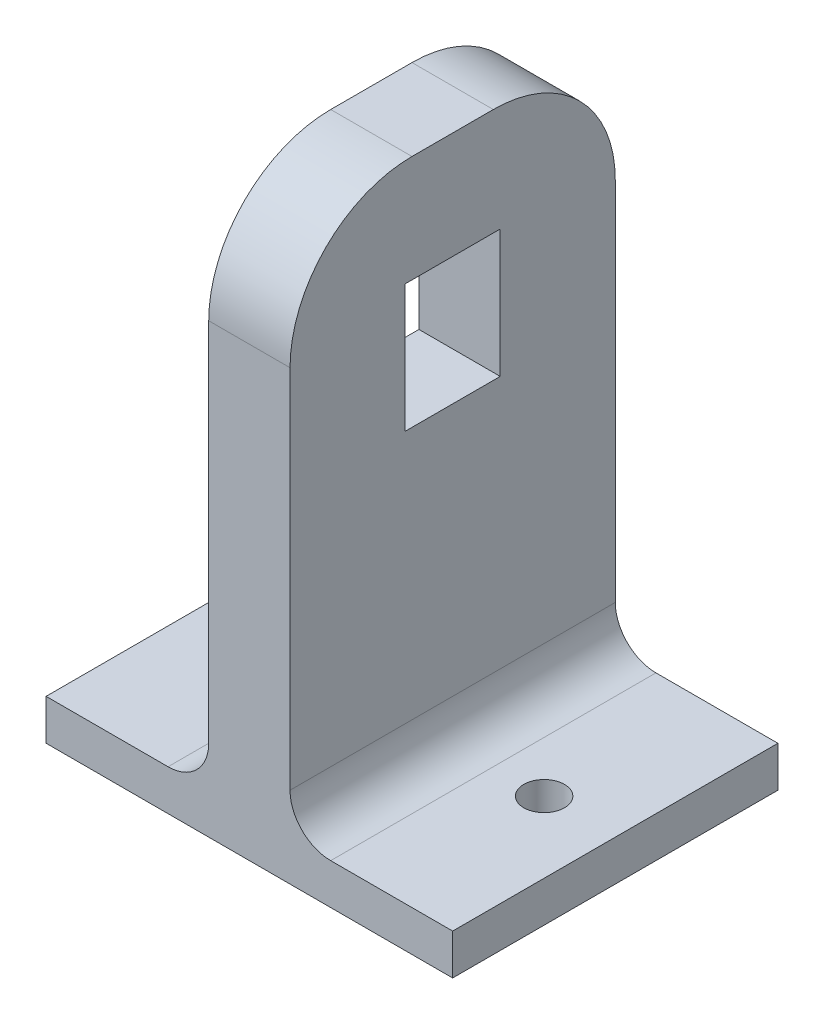
ISO-10303-21;
HEADER;
FILE_DESCRIPTION(('STEP AP214'),'2;1');
FILE_NAME('part.step','',(''),(''),'','','');
FILE_SCHEMA(('AUTOMOTIVE_DESIGN { 1 0 10303 214 1 1 1 1 }'));
ENDSEC;
DATA;
#1=APPLICATION_CONTEXT('core data for automotive mechanical design processes');
#2=APPLICATION_PROTOCOL_DEFINITION('international standard','automotive_design',2000,#1);
#3=PRODUCT_CONTEXT('',#1,'mechanical');
#4=PRODUCT('Part','Part','',(#3));
#5=PRODUCT_RELATED_PRODUCT_CATEGORY('part','',(#4));
#6=PRODUCT_DEFINITION_FORMATION('','',#4);
#7=PRODUCT_DEFINITION_CONTEXT('part definition',#1,'design');
#8=PRODUCT_DEFINITION('design','',#6,#7);
#9=PRODUCT_DEFINITION_SHAPE('','',#8);
#10=(LENGTH_UNIT() NAMED_UNIT(*) SI_UNIT(.MILLI.,.METRE.));
#11=(NAMED_UNIT(*) PLANE_ANGLE_UNIT() SI_UNIT($,.RADIAN.));
#12=(NAMED_UNIT(*) SI_UNIT($,.STERADIAN.) SOLID_ANGLE_UNIT());
#13=UNCERTAINTY_MEASURE_WITH_UNIT(LENGTH_MEASURE(1.E-05),#10,'distance_accuracy_value','');
#14=(GEOMETRIC_REPRESENTATION_CONTEXT(3) GLOBAL_UNCERTAINTY_ASSIGNED_CONTEXT((#13)) GLOBAL_UNIT_ASSIGNED_CONTEXT((#10,
#11,#12)) REPRESENTATION_CONTEXT('',''));
#15=CARTESIAN_POINT('',(0.,0.,0.));
#16=DIRECTION('',(0.,0.,1.));
#17=DIRECTION('',(1.,0.,0.));
#18=AXIS2_PLACEMENT_3D('',#15,#16,#17);
#19=CARTESIAN_POINT('',(6.35,0.,0.));
#20=DIRECTION('',(-1.,0.,0.));
#21=DIRECTION('',(0.,0.,1.));
#22=AXIS2_PLACEMENT_3D('',#19,#20,#21);
#23=PLANE('',#22);
#24=DIRECTION('',(0.,1.,0.));
#25=VECTOR('',#24,1.);
#26=CARTESIAN_POINT('',(6.35,7.81050000000002,-7.4295));
#27=LINE('',#26,#25);
#28=CARTESIAN_POINT('',(6.35,7.81050000000002,-7.4295));
#29=VERTEX_POINT('',#28);
#30=CARTESIAN_POINT('',(6.35,27.7495,-7.4295));
#31=VERTEX_POINT('',#30);
#32=EDGE_CURVE('E198',#29,#31,#27,.T.);
#33=ORIENTED_EDGE('',*,*,#32,.F.);
#34=DIRECTION('',(0.,0.,-1.));
#35=VECTOR('',#34,1.);
#36=CARTESIAN_POINT('',(6.35,7.81050000000002,7.4295));
#37=LINE('',#36,#35);
#38=CARTESIAN_POINT('',(6.35,7.81050000000002,7.4295));
#39=VERTEX_POINT('',#38);
#40=EDGE_CURVE('E206',#39,#29,#37,.T.);
#41=ORIENTED_EDGE('',*,*,#40,.F.);
#42=DIRECTION('',(0.,-1.,0.));
#43=VECTOR('',#42,1.);
#44=CARTESIAN_POINT('',(6.35,7.81050000000002,7.4295));
#45=LINE('',#44,#43);
#46=CARTESIAN_POINT('',(6.35,27.7495,7.4295));
#47=VERTEX_POINT('',#46);
#48=EDGE_CURVE('E203',#47,#39,#45,.T.);
#49=ORIENTED_EDGE('',*,*,#48,.F.);
#50=DIRECTION('',(0.,0.,1.));
#51=VECTOR('',#50,1.);
#52=CARTESIAN_POINT('',(6.35,27.7495,7.4295));
#53=LINE('',#52,#51);
#54=EDGE_CURVE('E200',#31,#47,#53,.T.);
#55=ORIENTED_EDGE('',*,*,#54,.F.);
#56=EDGE_LOOP('',(#33,#41,#49,#55));
#57=FACE_BOUND('',#56,.T.);
#58=DIRECTION('',(0.,1.,0.));
#59=VECTOR('',#58,1.);
#60=CARTESIAN_POINT('',(6.35,-44.45,-25.4));
#61=LINE('',#60,#59);
#62=CARTESIAN_POINT('',(6.35,-31.75,-25.4));
#63=VERTEX_POINT('',#62);
#64=CARTESIAN_POINT('',(6.35,25.4,-25.4));
#65=VERTEX_POINT('',#64);
#66=EDGE_CURVE('E229',#63,#65,#61,.T.);
#67=ORIENTED_EDGE('',*,*,#66,.T.);
#68=CARTESIAN_POINT('',(6.35,25.4,-6.35));
#69=DIRECTION('',(-1.,0.,0.));
#70=DIRECTION('',(0.,0.,1.));
#71=AXIS2_PLACEMENT_3D('',#68,#69,#70);
#72=CIRCLE('',#71,19.05);
#73=CARTESIAN_POINT('',(6.35,44.45,-6.35));
#74=VERTEX_POINT('',#73);
#75=EDGE_CURVE('E40',#65,#74,#72,.F.);
#76=ORIENTED_EDGE('',*,*,#75,.T.);
#77=DIRECTION('',(0.,0.,1.));
#78=VECTOR('',#77,1.);
#79=CARTESIAN_POINT('',(6.35,44.45,25.4));
#80=LINE('',#79,#78);
#81=CARTESIAN_POINT('',(6.35,44.45,6.35));
#82=VERTEX_POINT('',#81);
#83=EDGE_CURVE('E231',#74,#82,#80,.T.);
#84=ORIENTED_EDGE('',*,*,#83,.T.);
#85=CARTESIAN_POINT('',(6.35,25.4,6.35));
#86=DIRECTION('',(-1.,0.,0.));
#87=DIRECTION('',(0.,0.,1.));
#88=AXIS2_PLACEMENT_3D('',#85,#86,#87);
#89=CIRCLE('',#88,19.05);
#90=CARTESIAN_POINT('',(6.35,25.4,25.4));
#91=VERTEX_POINT('',#90);
#92=EDGE_CURVE('E47',#82,#91,#89,.F.);
#93=ORIENTED_EDGE('',*,*,#92,.T.);
#94=DIRECTION('',(0.,-1.,0.));
#95=VECTOR('',#94,1.);
#96=CARTESIAN_POINT('',(6.35,-44.45,25.4));
#97=LINE('',#96,#95);
#98=CARTESIAN_POINT('',(6.35,-31.75,25.4));
#99=VERTEX_POINT('',#98);
#100=EDGE_CURVE('E234',#91,#99,#97,.T.);
#101=ORIENTED_EDGE('',*,*,#100,.T.);
#102=DIRECTION('',(0.,0.,1.));
#103=VECTOR('',#102,1.);
#104=CARTESIAN_POINT('',(6.35,-31.75,-25.4));
#105=LINE('',#104,#103);
#106=EDGE_CURVE('E249',#99,#63,#105,.F.);
#107=ORIENTED_EDGE('',*,*,#106,.T.);
#108=EDGE_LOOP('',(#67,#76,#84,#93,#101,#107));
#109=FACE_BOUND('',#108,.T.);
#110=ADVANCED_FACE('F32',(#57,#109),#23,.F.);
#111=CARTESIAN_POINT('',(-6.35,0.,0.));
#112=DIRECTION('',(-1.,0.,0.));
#113=DIRECTION('',(0.,0.,1.));
#114=AXIS2_PLACEMENT_3D('',#111,#112,#113);
#115=PLANE('',#114);
#116=DIRECTION('',(0.,0.,-1.));
#117=VECTOR('',#116,1.);
#118=CARTESIAN_POINT('',(-6.35,7.81050000000002,7.4295));
#119=LINE('',#118,#117);
#120=CARTESIAN_POINT('',(-6.35,7.81050000000002,7.4295));
#121=VERTEX_POINT('',#120);
#122=CARTESIAN_POINT('',(-6.35,7.81050000000002,-7.4295));
#123=VERTEX_POINT('',#122);
#124=EDGE_CURVE('E201',#121,#123,#119,.T.);
#125=ORIENTED_EDGE('',*,*,#124,.T.);
#126=DIRECTION('',(0.,1.,0.));
#127=VECTOR('',#126,1.);
#128=CARTESIAN_POINT('',(-6.35,7.81050000000002,-7.4295));
#129=LINE('',#128,#127);
#130=CARTESIAN_POINT('',(-6.35,27.7495,-7.4295));
#131=VERTEX_POINT('',#130);
#132=EDGE_CURVE('E197',#123,#131,#129,.T.);
#133=ORIENTED_EDGE('',*,*,#132,.T.);
#134=DIRECTION('',(0.,0.,1.));
#135=VECTOR('',#134,1.);
#136=CARTESIAN_POINT('',(-6.35,27.7495,7.4295));
#137=LINE('',#136,#135);
#138=CARTESIAN_POINT('',(-6.35,27.7495,7.4295));
#139=VERTEX_POINT('',#138);
#140=EDGE_CURVE('E211',#131,#139,#137,.T.);
#141=ORIENTED_EDGE('',*,*,#140,.T.);
#142=DIRECTION('',(0.,-1.,0.));
#143=VECTOR('',#142,1.);
#144=CARTESIAN_POINT('',(-6.35,7.81050000000002,7.4295));
#145=LINE('',#144,#143);
#146=EDGE_CURVE('E214',#139,#121,#145,.T.);
#147=ORIENTED_EDGE('',*,*,#146,.T.);
#148=EDGE_LOOP('',(#125,#133,#141,#147));
#149=FACE_BOUND('',#148,.T.);
#150=DIRECTION('',(0.,0.,1.));
#151=VECTOR('',#150,1.);
#152=CARTESIAN_POINT('',(-6.35,44.45,25.4));
#153=LINE('',#152,#151);
#154=CARTESIAN_POINT('',(-6.35,44.45,-6.35));
#155=VERTEX_POINT('',#154);
#156=CARTESIAN_POINT('',(-6.35,44.45,6.35));
#157=VERTEX_POINT('',#156);
#158=EDGE_CURVE('E237',#155,#157,#153,.T.);
#159=ORIENTED_EDGE('',*,*,#158,.F.);
#160=CARTESIAN_POINT('',(-6.35,25.4,-6.35));
#161=DIRECTION('',(-1.,0.,0.));
#162=DIRECTION('',(0.,0.,1.));
#163=AXIS2_PLACEMENT_3D('',#160,#161,#162);
#164=CIRCLE('',#163,19.05);
#165=CARTESIAN_POINT('',(-6.35,25.4,-25.4));
#166=VERTEX_POINT('',#165);
#167=EDGE_CURVE('E267',#155,#166,#164,.T.);
#168=ORIENTED_EDGE('',*,*,#167,.T.);
#169=DIRECTION('',(0.,1.,0.));
#170=VECTOR('',#169,1.);
#171=CARTESIAN_POINT('',(-6.35,-44.45,-25.4));
#172=LINE('',#171,#170);
#173=CARTESIAN_POINT('',(-6.35,-31.75,-25.4));
#174=VERTEX_POINT('',#173);
#175=EDGE_CURVE('E228',#174,#166,#172,.T.);
#176=ORIENTED_EDGE('',*,*,#175,.F.);
#177=DIRECTION('',(0.,0.,1.));
#178=VECTOR('',#177,1.);
#179=CARTESIAN_POINT('',(-6.35,-31.75,0.));
#180=LINE('',#179,#178);
#181=CARTESIAN_POINT('',(-6.35,-31.75,25.4));
#182=VERTEX_POINT('',#181);
#183=EDGE_CURVE('E159',#174,#182,#180,.T.);
#184=ORIENTED_EDGE('',*,*,#183,.T.);
#185=DIRECTION('',(0.,-1.,0.));
#186=VECTOR('',#185,1.);
#187=CARTESIAN_POINT('',(-6.35,-44.45,25.4));
#188=LINE('',#187,#186);
#189=CARTESIAN_POINT('',(-6.35,25.4,25.4));
#190=VERTEX_POINT('',#189);
#191=EDGE_CURVE('E232',#190,#182,#188,.T.);
#192=ORIENTED_EDGE('',*,*,#191,.F.);
#193=CARTESIAN_POINT('',(-6.35,25.4,6.35));
#194=DIRECTION('',(-1.,0.,0.));
#195=DIRECTION('',(0.,0.,1.));
#196=AXIS2_PLACEMENT_3D('',#193,#194,#195);
#197=CIRCLE('',#196,19.05);
#198=EDGE_CURVE('E265',#190,#157,#197,.T.);
#199=ORIENTED_EDGE('',*,*,#198,.T.);
#200=EDGE_LOOP('',(#159,#168,#176,#184,#192,#199));
#201=FACE_BOUND('',#200,.T.);
#202=ADVANCED_FACE('F281',(#149,#201),#115,.T.);
#203=CARTESIAN_POINT('',(6.35,-44.45,-25.4));
#204=DIRECTION('',(0.,0.,1.));
#205=DIRECTION('',(1.,0.,0.));
#206=AXIS2_PLACEMENT_3D('',#203,#204,#205);
#207=PLANE('',#206);
#208=ORIENTED_EDGE('',*,*,#175,.T.);
#209=DIRECTION('',(-1.,0.,0.));
#210=VECTOR('',#209,1.);
#211=CARTESIAN_POINT('',(6.35,25.4,-25.4));
#212=LINE('',#211,#210);
#213=EDGE_CURVE('E55',#166,#65,#212,.F.);
#214=ORIENTED_EDGE('',*,*,#213,.T.);
#215=ORIENTED_EDGE('',*,*,#66,.F.);
#216=CARTESIAN_POINT('',(12.7,-31.75,-25.4));
#217=DIRECTION('',(0.,0.,1.));
#218=DIRECTION('',(1.,0.,0.));
#219=AXIS2_PLACEMENT_3D('',#216,#217,#218);
#220=CIRCLE('',#219,6.35);
#221=CARTESIAN_POINT('',(12.7,-38.1,-25.4));
#222=VERTEX_POINT('',#221);
#223=EDGE_CURVE('E258',#63,#222,#220,.T.);
#224=ORIENTED_EDGE('',*,*,#223,.T.);
#225=DIRECTION('',(-1.,0.,0.));
#226=VECTOR('',#225,1.);
#227=CARTESIAN_POINT('',(31.75,-38.1,-25.4));
#228=LINE('',#227,#226);
#229=CARTESIAN_POINT('',(31.75,-38.1,-25.4));
#230=VERTEX_POINT('',#229);
#231=EDGE_CURVE('E194',#230,#222,#228,.T.);
#232=ORIENTED_EDGE('',*,*,#231,.F.);
#233=DIRECTION('',(0.,1.,0.));
#234=VECTOR('',#233,1.);
#235=CARTESIAN_POINT('',(31.75,-44.45,-25.4));
#236=LINE('',#235,#234);
#237=CARTESIAN_POINT('',(31.75,-44.45,-25.4));
#238=VERTEX_POINT('',#237);
#239=EDGE_CURVE('E167',#238,#230,#236,.T.);
#240=ORIENTED_EDGE('',*,*,#239,.F.);
#241=DIRECTION('',(-1.,0.,0.));
#242=VECTOR('',#241,1.);
#243=CARTESIAN_POINT('',(6.35,-44.45,-25.4));
#244=LINE('',#243,#242);
#245=CARTESIAN_POINT('',(-31.75,-44.45,-25.4));
#246=VERTEX_POINT('',#245);
#247=EDGE_CURVE('E160',#238,#246,#244,.T.);
#248=ORIENTED_EDGE('',*,*,#247,.T.);
#249=DIRECTION('',(0.,1.,0.));
#250=VECTOR('',#249,1.);
#251=CARTESIAN_POINT('',(-31.75,-44.45,-25.4));
#252=LINE('',#251,#250);
#253=CARTESIAN_POINT('',(-31.75,-38.1,-25.4));
#254=VERTEX_POINT('',#253);
#255=EDGE_CURVE('E176',#246,#254,#252,.T.);
#256=ORIENTED_EDGE('',*,*,#255,.T.);
#257=CARTESIAN_POINT('',(-12.7,-38.1,-25.4));
#258=VERTEX_POINT('',#257);
#259=EDGE_CURVE('E193',#258,#254,#228,.T.);
#260=ORIENTED_EDGE('',*,*,#259,.F.);
#261=CARTESIAN_POINT('',(-12.7,-31.75,-25.4));
#262=DIRECTION('',(0.,0.,1.));
#263=DIRECTION('',(1.,0.,0.));
#264=AXIS2_PLACEMENT_3D('',#261,#262,#263);
#265=CIRCLE('',#264,6.35);
#266=EDGE_CURVE('E253',#258,#174,#265,.T.);
#267=ORIENTED_EDGE('',*,*,#266,.T.);
#268=EDGE_LOOP('',(#208,#214,#215,#224,#232,#240,#248,#256,#260,#267));
#269=FACE_BOUND('',#268,.T.);
#270=ADVANCED_FACE('F283',(#269),#207,.F.);
#271=CARTESIAN_POINT('',(6.35,44.45,25.4));
#272=DIRECTION('',(0.,-1.,0.));
#273=DIRECTION('',(0.,0.,-1.));
#274=AXIS2_PLACEMENT_3D('',#271,#272,#273);
#275=PLANE('',#274);
#276=ORIENTED_EDGE('',*,*,#83,.F.);
#277=DIRECTION('',(-1.,0.,0.));
#278=VECTOR('',#277,1.);
#279=CARTESIAN_POINT('',(6.35,44.45,-6.35));
#280=LINE('',#279,#278);
#281=EDGE_CURVE('E262',#74,#155,#280,.T.);
#282=ORIENTED_EDGE('',*,*,#281,.T.);
#283=ORIENTED_EDGE('',*,*,#158,.T.);
#284=DIRECTION('',(-1.,0.,0.));
#285=VECTOR('',#284,1.);
#286=CARTESIAN_POINT('',(6.35,44.45,6.35));
#287=LINE('',#286,#285);
#288=EDGE_CURVE('E260',#157,#82,#287,.F.);
#289=ORIENTED_EDGE('',*,*,#288,.T.);
#290=EDGE_LOOP('',(#276,#282,#283,#289));
#291=FACE_BOUND('',#290,.T.);
#292=ADVANCED_FACE('F275',(#291),#275,.F.);
#293=CARTESIAN_POINT('',(6.35,-44.45,25.4));
#294=DIRECTION('',(0.,0.,-1.));
#295=DIRECTION('',(-1.,0.,0.));
#296=AXIS2_PLACEMENT_3D('',#293,#294,#295);
#297=PLANE('',#296);
#298=ORIENTED_EDGE('',*,*,#100,.F.);
#299=DIRECTION('',(-1.,0.,0.));
#300=VECTOR('',#299,1.);
#301=CARTESIAN_POINT('',(6.35,25.4,25.4));
#302=LINE('',#301,#300);
#303=EDGE_CURVE('E11',#91,#190,#302,.T.);
#304=ORIENTED_EDGE('',*,*,#303,.T.);
#305=ORIENTED_EDGE('',*,*,#191,.T.);
#306=CARTESIAN_POINT('',(-12.7,-31.75,25.4));
#307=DIRECTION('',(0.,0.,-1.));
#308=DIRECTION('',(-1.,0.,0.));
#309=AXIS2_PLACEMENT_3D('',#306,#307,#308);
#310=CIRCLE('',#309,6.35);
#311=CARTESIAN_POINT('',(-12.7,-38.1,25.4));
#312=VERTEX_POINT('',#311);
#313=EDGE_CURVE('E251',#182,#312,#310,.T.);
#314=ORIENTED_EDGE('',*,*,#313,.T.);
#315=DIRECTION('',(-1.,0.,0.));
#316=VECTOR('',#315,1.);
#317=CARTESIAN_POINT('',(31.75,-38.1,25.4));
#318=LINE('',#317,#316);
#319=CARTESIAN_POINT('',(-31.75,-38.1,25.4));
#320=VERTEX_POINT('',#319);
#321=EDGE_CURVE('E184',#312,#320,#318,.T.);
#322=ORIENTED_EDGE('',*,*,#321,.T.);
#323=DIRECTION('',(0.,-1.,0.));
#324=VECTOR('',#323,1.);
#325=CARTESIAN_POINT('',(-31.75,-44.45,25.4));
#326=LINE('',#325,#324);
#327=CARTESIAN_POINT('',(-31.75,-44.45,25.4));
#328=VERTEX_POINT('',#327);
#329=EDGE_CURVE('E155',#320,#328,#326,.T.);
#330=ORIENTED_EDGE('',*,*,#329,.T.);
#331=DIRECTION('',(-1.,0.,0.));
#332=VECTOR('',#331,1.);
#333=CARTESIAN_POINT('',(6.35,-44.45,25.4));
#334=LINE('',#333,#332);
#335=CARTESIAN_POINT('',(31.75,-44.45,25.4));
#336=VERTEX_POINT('',#335);
#337=EDGE_CURVE('E148',#336,#328,#334,.T.);
#338=ORIENTED_EDGE('',*,*,#337,.F.);
#339=DIRECTION('',(0.,-1.,0.));
#340=VECTOR('',#339,1.);
#341=CARTESIAN_POINT('',(31.75,-44.45,25.4));
#342=LINE('',#341,#340);
#343=CARTESIAN_POINT('',(31.75,-38.1,25.4));
#344=VERTEX_POINT('',#343);
#345=EDGE_CURVE('E153',#344,#336,#342,.T.);
#346=ORIENTED_EDGE('',*,*,#345,.F.);
#347=CARTESIAN_POINT('',(12.7,-38.1,25.4));
#348=VERTEX_POINT('',#347);
#349=EDGE_CURVE('E191',#344,#348,#318,.T.);
#350=ORIENTED_EDGE('',*,*,#349,.T.);
#351=CARTESIAN_POINT('',(12.7,-31.75,25.4));
#352=DIRECTION('',(0.,0.,-1.));
#353=DIRECTION('',(-1.,0.,0.));
#354=AXIS2_PLACEMENT_3D('',#351,#352,#353);
#355=CIRCLE('',#354,6.35);
#356=EDGE_CURVE('E255',#348,#99,#355,.T.);
#357=ORIENTED_EDGE('',*,*,#356,.T.);
#358=EDGE_LOOP('',(#298,#304,#305,#314,#322,#330,#338,#346,#350,#357));
#359=FACE_BOUND('',#358,.T.);
#360=ADVANCED_FACE('F150',(#359),#297,.F.);
#361=CARTESIAN_POINT('',(6.35,-44.45,25.4));
#362=DIRECTION('',(0.,1.,0.));
#363=DIRECTION('',(0.,0.,1.));
#364=AXIS2_PLACEMENT_3D('',#361,#362,#363);
#365=PLANE('',#364);
#366=CARTESIAN_POINT('',(-20.6375,-44.45,0.));
#367=DIRECTION('',(0.,-1.,0.));
#368=DIRECTION('',(0.,0.,1.));
#369=AXIS2_PLACEMENT_3D('',#366,#367,#368);
#370=CIRCLE('',#369,3.175);
#371=CARTESIAN_POINT('',(-20.6375,-44.45,3.175));
#372=VERTEX_POINT('',#371);
#373=EDGE_CURVE('E504',#372,#372,#370,.T.);
#374=ORIENTED_EDGE('',*,*,#373,.F.);
#375=EDGE_LOOP('',(#374));
#376=FACE_BOUND('',#375,.T.);
#377=CARTESIAN_POINT('',(20.6375,-44.45,0.));
#378=DIRECTION('',(0.,1.,0.));
#379=DIRECTION('',(0.,0.,1.));
#380=AXIS2_PLACEMENT_3D('',#377,#378,#379);
#381=CIRCLE('',#380,3.175);
#382=CARTESIAN_POINT('',(20.6375,-44.45,3.175));
#383=VERTEX_POINT('',#382);
#384=EDGE_CURVE('E187',#383,#383,#381,.T.);
#385=ORIENTED_EDGE('',*,*,#384,.T.);
#386=EDGE_LOOP('',(#385));
#387=FACE_BOUND('',#386,.T.);
#388=ORIENTED_EDGE('',*,*,#337,.T.);
#389=DIRECTION('',(0.,0.,-1.));
#390=VECTOR('',#389,1.);
#391=CARTESIAN_POINT('',(-31.75,-44.45,25.4));
#392=LINE('',#391,#390);
#393=EDGE_CURVE('E186',#328,#246,#392,.T.);
#394=ORIENTED_EDGE('',*,*,#393,.T.);
#395=ORIENTED_EDGE('',*,*,#247,.F.);
#396=DIRECTION('',(0.,0.,-1.));
#397=VECTOR('',#396,1.);
#398=CARTESIAN_POINT('',(31.75,-44.45,25.4));
#399=LINE('',#398,#397);
#400=EDGE_CURVE('E163',#336,#238,#399,.T.);
#401=ORIENTED_EDGE('',*,*,#400,.F.);
#402=EDGE_LOOP('',(#388,#394,#395,#401));
#403=FACE_BOUND('',#402,.T.);
#404=ADVANCED_FACE('F164',(#376,#387,#403),#365,.F.);
#405=CARTESIAN_POINT('',(6.35,7.81050000000002,-7.4295));
#406=DIRECTION('',(0.,0.,1.));
#407=DIRECTION('',(1.,0.,0.));
#408=AXIS2_PLACEMENT_3D('',#405,#406,#407);
#409=PLANE('',#408);
#410=ORIENTED_EDGE('',*,*,#132,.F.);
#411=DIRECTION('',(-1.,0.,0.));
#412=VECTOR('',#411,1.);
#413=CARTESIAN_POINT('',(6.35,7.81050000000002,-7.4295));
#414=LINE('',#413,#412);
#415=EDGE_CURVE('E208',#29,#123,#414,.T.);
#416=ORIENTED_EDGE('',*,*,#415,.F.);
#417=ORIENTED_EDGE('',*,*,#32,.T.);
#418=DIRECTION('',(-1.,0.,0.));
#419=VECTOR('',#418,1.);
#420=CARTESIAN_POINT('',(6.35,27.7495,-7.4295));
#421=LINE('',#420,#419);
#422=EDGE_CURVE('E225',#31,#131,#421,.T.);
#423=ORIENTED_EDGE('',*,*,#422,.T.);
#424=EDGE_LOOP('',(#410,#416,#417,#423));
#425=FACE_BOUND('',#424,.T.);
#426=ADVANCED_FACE('F309',(#425),#409,.T.);
#427=CARTESIAN_POINT('',(6.35,27.7495,7.4295));
#428=DIRECTION('',(0.,-1.,0.));
#429=DIRECTION('',(0.,0.,-1.));
#430=AXIS2_PLACEMENT_3D('',#427,#428,#429);
#431=PLANE('',#430);
#432=ORIENTED_EDGE('',*,*,#140,.F.);
#433=ORIENTED_EDGE('',*,*,#422,.F.);
#434=ORIENTED_EDGE('',*,*,#54,.T.);
#435=DIRECTION('',(-1.,0.,0.));
#436=VECTOR('',#435,1.);
#437=CARTESIAN_POINT('',(6.35,27.7495,7.4295));
#438=LINE('',#437,#436);
#439=EDGE_CURVE('E223',#47,#139,#438,.T.);
#440=ORIENTED_EDGE('',*,*,#439,.T.);
#441=EDGE_LOOP('',(#432,#433,#434,#440));
#442=FACE_BOUND('',#441,.T.);
#443=ADVANCED_FACE('F358',(#442),#431,.T.);
#444=CARTESIAN_POINT('',(6.35,7.81050000000002,7.4295));
#445=DIRECTION('',(0.,0.,-1.));
#446=DIRECTION('',(-1.,0.,0.));
#447=AXIS2_PLACEMENT_3D('',#444,#445,#446);
#448=PLANE('',#447);
#449=ORIENTED_EDGE('',*,*,#146,.F.);
#450=ORIENTED_EDGE('',*,*,#439,.F.);
#451=ORIENTED_EDGE('',*,*,#48,.T.);
#452=DIRECTION('',(-1.,0.,0.));
#453=VECTOR('',#452,1.);
#454=CARTESIAN_POINT('',(6.35,7.81050000000002,7.4295));
#455=LINE('',#454,#453);
#456=EDGE_CURVE('E221',#39,#121,#455,.T.);
#457=ORIENTED_EDGE('',*,*,#456,.T.);
#458=EDGE_LOOP('',(#449,#450,#451,#457));
#459=FACE_BOUND('',#458,.T.);
#460=ADVANCED_FACE('F355',(#459),#448,.T.);
#461=CARTESIAN_POINT('',(6.35,7.81050000000002,7.4295));
#462=DIRECTION('',(0.,1.,0.));
#463=DIRECTION('',(0.,0.,1.));
#464=AXIS2_PLACEMENT_3D('',#461,#462,#463);
#465=PLANE('',#464);
#466=ORIENTED_EDGE('',*,*,#124,.F.);
#467=ORIENTED_EDGE('',*,*,#456,.F.);
#468=ORIENTED_EDGE('',*,*,#40,.T.);
#469=ORIENTED_EDGE('',*,*,#415,.T.);
#470=EDGE_LOOP('',(#466,#467,#468,#469));
#471=FACE_BOUND('',#470,.T.);
#472=ADVANCED_FACE('F352',(#471),#465,.T.);
#473=CARTESIAN_POINT('',(-31.75,0.,0.));
#474=DIRECTION('',(-1.,0.,0.));
#475=DIRECTION('',(0.,0.,1.));
#476=AXIS2_PLACEMENT_3D('',#473,#474,#475);
#477=PLANE('',#476);
#478=ORIENTED_EDGE('',*,*,#329,.F.);
#479=DIRECTION('',(0.,0.,1.));
#480=VECTOR('',#479,1.);
#481=CARTESIAN_POINT('',(-31.75,-38.1,25.4));
#482=LINE('',#481,#480);
#483=EDGE_CURVE('E173',#254,#320,#482,.T.);
#484=ORIENTED_EDGE('',*,*,#483,.F.);
#485=ORIENTED_EDGE('',*,*,#255,.F.);
#486=ORIENTED_EDGE('',*,*,#393,.F.);
#487=EDGE_LOOP('',(#478,#484,#485,#486));
#488=FACE_BOUND('',#487,.T.);
#489=ADVANCED_FACE('F347',(#488),#477,.T.);
#490=CARTESIAN_POINT('',(31.75,-38.1,25.4));
#491=DIRECTION('',(0.,-1.,0.));
#492=DIRECTION('',(0.,0.,-1.));
#493=AXIS2_PLACEMENT_3D('',#490,#491,#492);
#494=PLANE('',#493);
#495=CARTESIAN_POINT('',(-20.6375,-38.1,0.));
#496=DIRECTION('',(0.,-1.,0.));
#497=DIRECTION('',(0.,0.,1.));
#498=AXIS2_PLACEMENT_3D('',#495,#496,#497);
#499=CIRCLE('',#498,3.175);
#500=CARTESIAN_POINT('',(-20.6375,-38.1,3.175));
#501=VERTEX_POINT('',#500);
#502=EDGE_CURVE('E507',#501,#501,#499,.T.);
#503=ORIENTED_EDGE('',*,*,#502,.T.);
#504=EDGE_LOOP('',(#503));
#505=FACE_BOUND('',#504,.T.);
#506=ORIENTED_EDGE('',*,*,#321,.F.);
#507=DIRECTION('',(0.,0.,1.));
#508=VECTOR('',#507,1.);
#509=CARTESIAN_POINT('',(-12.7,-38.1,25.4));
#510=LINE('',#509,#508);
#511=EDGE_CURVE('E244',#312,#258,#510,.F.);
#512=ORIENTED_EDGE('',*,*,#511,.T.);
#513=ORIENTED_EDGE('',*,*,#259,.T.);
#514=ORIENTED_EDGE('',*,*,#483,.T.);
#515=EDGE_LOOP('',(#506,#512,#513,#514));
#516=FACE_BOUND('',#515,.T.);
#517=ADVANCED_FACE('F339',(#505,#516),#494,.F.);
#518=CARTESIAN_POINT('',(20.6375,-38.1,0.));
#519=DIRECTION('',(0.,1.,0.));
#520=DIRECTION('',(0.,0.,1.));
#521=AXIS2_PLACEMENT_3D('',#518,#519,#520);
#522=CIRCLE('',#521,3.175);
#523=CARTESIAN_POINT('',(20.6375,-38.1,3.175));
#524=VERTEX_POINT('',#523);
#525=EDGE_CURVE('E179',#524,#524,#522,.T.);
#526=ORIENTED_EDGE('',*,*,#525,.F.);
#527=EDGE_LOOP('',(#526));
#528=FACE_BOUND('',#527,.T.);
#529=ORIENTED_EDGE('',*,*,#231,.T.);
#530=DIRECTION('',(0.,0.,1.));
#531=VECTOR('',#530,1.);
#532=CARTESIAN_POINT('',(12.7,-38.1,25.4));
#533=LINE('',#532,#531);
#534=EDGE_CURVE('E246',#222,#348,#533,.T.);
#535=ORIENTED_EDGE('',*,*,#534,.T.);
#536=ORIENTED_EDGE('',*,*,#349,.F.);
#537=DIRECTION('',(0.,0.,1.));
#538=VECTOR('',#537,1.);
#539=CARTESIAN_POINT('',(31.75,-38.1,25.4));
#540=LINE('',#539,#538);
#541=EDGE_CURVE('E171',#230,#344,#540,.T.);
#542=ORIENTED_EDGE('',*,*,#541,.F.);
#543=EDGE_LOOP('',(#529,#535,#536,#542));
#544=FACE_BOUND('',#543,.T.);
#545=ADVANCED_FACE('F337',(#528,#544),#494,.F.);
#546=CARTESIAN_POINT('',(31.75,0.,0.));
#547=DIRECTION('',(-1.,0.,0.));
#548=DIRECTION('',(0.,0.,1.));
#549=AXIS2_PLACEMENT_3D('',#546,#547,#548);
#550=PLANE('',#549);
#551=ORIENTED_EDGE('',*,*,#345,.T.);
#552=ORIENTED_EDGE('',*,*,#400,.T.);
#553=ORIENTED_EDGE('',*,*,#239,.T.);
#554=ORIENTED_EDGE('',*,*,#541,.T.);
#555=EDGE_LOOP('',(#551,#552,#553,#554));
#556=FACE_BOUND('',#555,.T.);
#557=ADVANCED_FACE('F169',(#556),#550,.F.);
#558=CARTESIAN_POINT('',(-12.7,-31.75,0.));
#559=DIRECTION('',(0.,0.,1.));
#560=DIRECTION('',(1.,0.,0.));
#561=AXIS2_PLACEMENT_3D('',#558,#559,#560);
#562=CYLINDRICAL_SURFACE('',#561,6.35);
#563=ORIENTED_EDGE('',*,*,#266,.F.);
#564=ORIENTED_EDGE('',*,*,#511,.F.);
#565=ORIENTED_EDGE('',*,*,#313,.F.);
#566=ORIENTED_EDGE('',*,*,#183,.F.);
#567=EDGE_LOOP('',(#563,#564,#565,#566));
#568=FACE_BOUND('',#567,.T.);
#569=ADVANCED_FACE('F288',(#568),#562,.F.);
#570=CARTESIAN_POINT('',(12.7,-31.75,25.4));
#571=DIRECTION('',(0.,0.,-1.));
#572=DIRECTION('',(-1.,0.,0.));
#573=AXIS2_PLACEMENT_3D('',#570,#571,#572);
#574=CYLINDRICAL_SURFACE('',#573,6.35);
#575=ORIENTED_EDGE('',*,*,#223,.F.);
#576=ORIENTED_EDGE('',*,*,#106,.F.);
#577=ORIENTED_EDGE('',*,*,#356,.F.);
#578=ORIENTED_EDGE('',*,*,#534,.F.);
#579=EDGE_LOOP('',(#575,#576,#577,#578));
#580=FACE_BOUND('',#579,.T.);
#581=ADVANCED_FACE('F323',(#580),#574,.F.);
#582=CARTESIAN_POINT('',(20.6375,-44.45,0.));
#583=DIRECTION('',(0.,1.,0.));
#584=DIRECTION('',(0.,0.,1.));
#585=AXIS2_PLACEMENT_3D('',#582,#583,#584);
#586=CYLINDRICAL_SURFACE('',#585,3.175);
#587=ORIENTED_EDGE('',*,*,#384,.F.);
#588=EDGE_LOOP('',(#587));
#589=FACE_BOUND('',#588,.T.);
#590=ORIENTED_EDGE('',*,*,#525,.T.);
#591=EDGE_LOOP('',(#590));
#592=FACE_BOUND('',#591,.T.);
#593=ADVANCED_FACE('F325',(#589,#592),#586,.F.);
#594=CARTESIAN_POINT('',(-20.6375,-44.45,0.));
#595=DIRECTION('',(0.,1.,0.));
#596=DIRECTION('',(0.,0.,1.));
#597=AXIS2_PLACEMENT_3D('',#594,#595,#596);
#598=CYLINDRICAL_SURFACE('',#597,3.175);
#599=ORIENTED_EDGE('',*,*,#373,.T.);
#600=EDGE_LOOP('',(#599));
#601=FACE_BOUND('',#600,.T.);
#602=ORIENTED_EDGE('',*,*,#502,.F.);
#603=EDGE_LOOP('',(#602));
#604=FACE_BOUND('',#603,.T.);
#605=ADVANCED_FACE('F298',(#601,#604),#598,.F.);
#606=CARTESIAN_POINT('',(6.35,25.4,-6.35));
#607=DIRECTION('',(-1.,0.,0.));
#608=DIRECTION('',(0.,0.,1.));
#609=AXIS2_PLACEMENT_3D('',#606,#607,#608);
#610=CYLINDRICAL_SURFACE('',#609,19.05);
#611=ORIENTED_EDGE('',*,*,#75,.F.);
#612=ORIENTED_EDGE('',*,*,#213,.F.);
#613=ORIENTED_EDGE('',*,*,#167,.F.);
#614=ORIENTED_EDGE('',*,*,#281,.F.);
#615=EDGE_LOOP('',(#611,#612,#613,#614));
#616=FACE_BOUND('',#615,.T.);
#617=ADVANCED_FACE('F278',(#616),#610,.T.);
#618=CARTESIAN_POINT('',(6.35,25.4,6.35));
#619=DIRECTION('',(-1.,0.,0.));
#620=DIRECTION('',(0.,0.,1.));
#621=AXIS2_PLACEMENT_3D('',#618,#619,#620);
#622=CYLINDRICAL_SURFACE('',#621,19.05);
#623=ORIENTED_EDGE('',*,*,#92,.F.);
#624=ORIENTED_EDGE('',*,*,#288,.F.);
#625=ORIENTED_EDGE('',*,*,#198,.F.);
#626=ORIENTED_EDGE('',*,*,#303,.F.);
#627=EDGE_LOOP('',(#623,#624,#625,#626));
#628=FACE_BOUND('',#627,.T.);
#629=ADVANCED_FACE('F34',(#628),#622,.T.);
#630=CLOSED_SHELL('',(#110,#202,#270,#292,#360,#404,#426,#443,#460,#472,#489,#517,#545,#557,
#569,#581,#593,#605,#617,#629));
#631=MANIFOLD_SOLID_BREP('B2',#630);
#632=ADVANCED_BREP_SHAPE_REPRESENTATION('',(#18,#631),#14);
#633=SHAPE_DEFINITION_REPRESENTATION(#9,#632);
ENDSEC;
END-ISO-10303-21;
